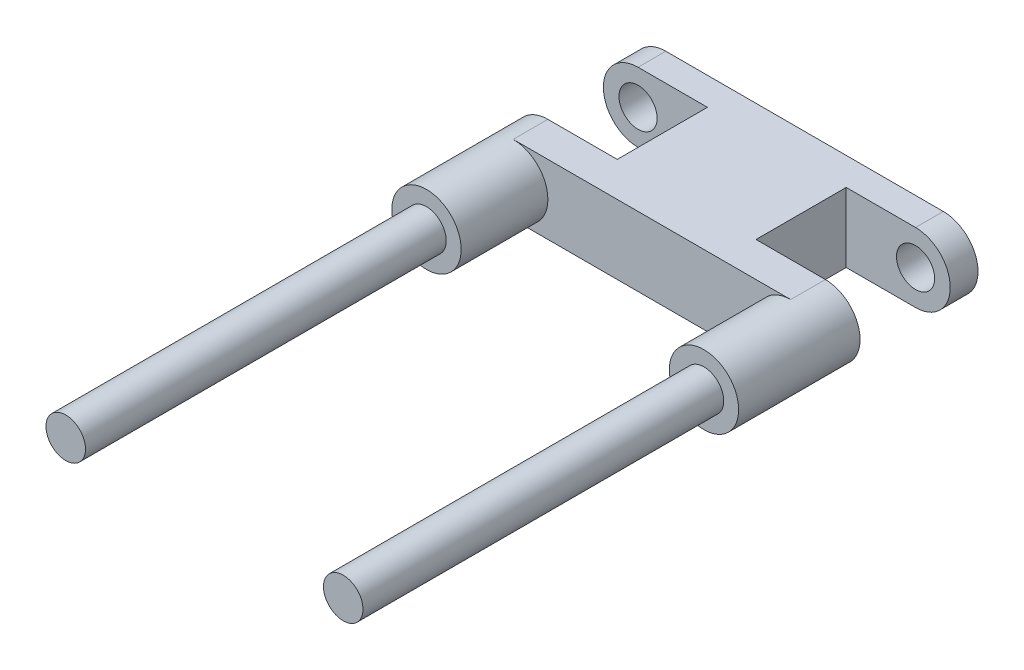
ISO-10303-21;
HEADER;
FILE_DESCRIPTION(('STEP AP214'),'2;1');
FILE_NAME('part.step','',(''),(''),'','','');
FILE_SCHEMA(('AUTOMOTIVE_DESIGN { 1 0 10303 214 1 1 1 1 }'));
ENDSEC;
DATA;
#1=APPLICATION_CONTEXT('core data for automotive mechanical design processes');
#2=APPLICATION_PROTOCOL_DEFINITION('international standard','automotive_design',2000,#1);
#3=PRODUCT_CONTEXT('',#1,'mechanical');
#4=PRODUCT('Part','Part','',(#3));
#5=PRODUCT_RELATED_PRODUCT_CATEGORY('part','',(#4));
#6=PRODUCT_DEFINITION_FORMATION('','',#4);
#7=PRODUCT_DEFINITION_CONTEXT('part definition',#1,'design');
#8=PRODUCT_DEFINITION('design','',#6,#7);
#9=PRODUCT_DEFINITION_SHAPE('','',#8);
#10=(LENGTH_UNIT() NAMED_UNIT(*) SI_UNIT(.MILLI.,.METRE.));
#11=(NAMED_UNIT(*) PLANE_ANGLE_UNIT() SI_UNIT($,.RADIAN.));
#12=(NAMED_UNIT(*) SI_UNIT($,.STERADIAN.) SOLID_ANGLE_UNIT());
#13=UNCERTAINTY_MEASURE_WITH_UNIT(LENGTH_MEASURE(1.E-05),#10,'distance_accuracy_value','');
#14=(GEOMETRIC_REPRESENTATION_CONTEXT(3) GLOBAL_UNCERTAINTY_ASSIGNED_CONTEXT((#13)) GLOBAL_UNIT_ASSIGNED_CONTEXT((#10,
#11,#12)) REPRESENTATION_CONTEXT('',''));
#15=CARTESIAN_POINT('',(0.,0.,0.));
#16=DIRECTION('',(0.,0.,1.));
#17=DIRECTION('',(1.,0.,0.));
#18=AXIS2_PLACEMENT_3D('',#15,#16,#17);
#19=CARTESIAN_POINT('',(-20.,-30.,2.));
#20=DIRECTION('',(0.,0.,-1.));
#21=DIRECTION('',(-1.,0.,0.));
#22=AXIS2_PLACEMENT_3D('',#19,#20,#21);
#23=CYLINDRICAL_SURFACE('',#22,5.);
#24=CARTESIAN_POINT('',(-20.,-30.,0.));
#25=DIRECTION('',(0.,0.,1.));
#26=DIRECTION('',(1.,0.,0.));
#27=AXIS2_PLACEMENT_3D('',#24,#25,#26);
#28=CIRCLE('',#27,5.);
#29=CARTESIAN_POINT('',(-20.,-25.,0.));
#30=VERTEX_POINT('',#29);
#31=CARTESIAN_POINT('',(-20.,-35.,0.));
#32=VERTEX_POINT('',#31);
#33=EDGE_CURVE('E233',#30,#32,#28,.T.);
#34=ORIENTED_EDGE('',*,*,#33,.T.);
#35=DIRECTION('',(0.,0.,-1.));
#36=VECTOR('',#35,1.);
#37=CARTESIAN_POINT('',(-20.,-35.,2.));
#38=LINE('',#37,#36);
#39=CARTESIAN_POINT('',(-20.,-35.,4.));
#40=VERTEX_POINT('',#39);
#41=EDGE_CURVE('E245',#40,#32,#38,.T.);
#42=ORIENTED_EDGE('',*,*,#41,.F.);
#43=CARTESIAN_POINT('',(-20.,-30.,4.));
#44=DIRECTION('',(0.,0.,1.));
#45=DIRECTION('',(1.,0.,0.));
#46=AXIS2_PLACEMENT_3D('',#43,#44,#45);
#47=CIRCLE('',#46,5.);
#48=CARTESIAN_POINT('',(-20.,-25.,4.));
#49=VERTEX_POINT('',#48);
#50=EDGE_CURVE('E171',#49,#40,#47,.T.);
#51=ORIENTED_EDGE('',*,*,#50,.F.);
#52=DIRECTION('',(0.,0.,-1.));
#53=VECTOR('',#52,1.);
#54=CARTESIAN_POINT('',(-20.,-25.,2.));
#55=LINE('',#54,#53);
#56=EDGE_CURVE('E138',#49,#30,#55,.T.);
#57=ORIENTED_EDGE('',*,*,#56,.T.);
#58=EDGE_LOOP('',(#34,#42,#51,#57));
#59=FACE_BOUND('',#58,.T.);
#60=ADVANCED_FACE('F35',(#59),#23,.T.);
#61=CARTESIAN_POINT('',(0.,-35.,2.));
#62=DIRECTION('',(0.,1.,0.));
#63=DIRECTION('',(-1.,0.,0.));
#64=AXIS2_PLACEMENT_3D('',#61,#62,#63);
#65=PLANE('',#64);
#66=DIRECTION('',(0.,0.,-1.));
#67=VECTOR('',#66,1.);
#68=CARTESIAN_POINT('',(20.,-35.,2.));
#69=LINE('',#68,#67);
#70=CARTESIAN_POINT('',(20.,-35.,4.));
#71=VERTEX_POINT('',#70);
#72=CARTESIAN_POINT('',(20.,-35.,0.));
#73=VERTEX_POINT('',#72);
#74=EDGE_CURVE('E137',#71,#73,#69,.T.);
#75=ORIENTED_EDGE('',*,*,#74,.F.);
#76=DIRECTION('',(1.,0.,0.));
#77=VECTOR('',#76,1.);
#78=CARTESIAN_POINT('',(10.,-35.,4.));
#79=LINE('',#78,#77);
#80=CARTESIAN_POINT('',(10.,-35.,4.));
#81=VERTEX_POINT('',#80);
#82=EDGE_CURVE('E151',#81,#71,#79,.T.);
#83=ORIENTED_EDGE('',*,*,#82,.F.);
#84=DIRECTION('',(0.,0.,-1.));
#85=VECTOR('',#84,1.);
#86=CARTESIAN_POINT('',(10.,-35.,17.));
#87=LINE('',#86,#85);
#88=CARTESIAN_POINT('',(10.,-35.,17.));
#89=VERTEX_POINT('',#88);
#90=EDGE_CURVE('E52',#89,#81,#87,.T.);
#91=ORIENTED_EDGE('',*,*,#90,.F.);
#92=DIRECTION('',(1.,0.,0.));
#93=VECTOR('',#92,1.);
#94=CARTESIAN_POINT('',(0.,-35.,17.));
#95=LINE('',#94,#93);
#96=CARTESIAN_POINT('',(20.,-35.,17.));
#97=VERTEX_POINT('',#96);
#98=EDGE_CURVE('E203',#89,#97,#95,.T.);
#99=ORIENTED_EDGE('',*,*,#98,.T.);
#100=DIRECTION('',(0.,0.,-1.));
#101=VECTOR('',#100,1.);
#102=CARTESIAN_POINT('',(20.,-35.,22.));
#103=LINE('',#102,#101);
#104=CARTESIAN_POINT('',(20.,-35.,22.));
#105=VERTEX_POINT('',#104);
#106=EDGE_CURVE('E210',#105,#97,#103,.T.);
#107=ORIENTED_EDGE('',*,*,#106,.F.);
#108=DIRECTION('',(1.,0.,0.));
#109=VECTOR('',#108,1.);
#110=CARTESIAN_POINT('',(0.,-35.,22.));
#111=LINE('',#110,#109);
#112=CARTESIAN_POINT('',(-20.,-35.,22.));
#113=VERTEX_POINT('',#112);
#114=EDGE_CURVE('E195',#113,#105,#111,.T.);
#115=ORIENTED_EDGE('',*,*,#114,.F.);
#116=DIRECTION('',(0.,0.,-1.));
#117=VECTOR('',#116,1.);
#118=CARTESIAN_POINT('',(-20.,-35.,22.));
#119=LINE('',#118,#117);
#120=CARTESIAN_POINT('',(-20.,-35.,17.));
#121=VERTEX_POINT('',#120);
#122=EDGE_CURVE('E213',#113,#121,#119,.T.);
#123=ORIENTED_EDGE('',*,*,#122,.T.);
#124=CARTESIAN_POINT('',(-10.,-35.,17.));
#125=VERTEX_POINT('',#124);
#126=EDGE_CURVE('E204',#121,#125,#95,.T.);
#127=ORIENTED_EDGE('',*,*,#126,.T.);
#128=DIRECTION('',(0.,0.,-1.));
#129=VECTOR('',#128,1.);
#130=CARTESIAN_POINT('',(-10.,-35.,17.));
#131=LINE('',#130,#129);
#132=CARTESIAN_POINT('',(-10.,-35.,4.));
#133=VERTEX_POINT('',#132);
#134=EDGE_CURVE('E225',#125,#133,#131,.T.);
#135=ORIENTED_EDGE('',*,*,#134,.T.);
#136=DIRECTION('',(1.,0.,0.));
#137=VECTOR('',#136,1.);
#138=CARTESIAN_POINT('',(-20.,-35.,4.));
#139=LINE('',#138,#137);
#140=EDGE_CURVE('E162',#40,#133,#139,.T.);
#141=ORIENTED_EDGE('',*,*,#140,.F.);
#142=ORIENTED_EDGE('',*,*,#41,.T.);
#143=DIRECTION('',(1.,0.,0.));
#144=VECTOR('',#143,1.);
#145=CARTESIAN_POINT('',(0.,-35.,0.));
#146=LINE('',#145,#144);
#147=EDGE_CURVE('E236',#32,#73,#146,.T.);
#148=ORIENTED_EDGE('',*,*,#147,.T.);
#149=EDGE_LOOP('',(#75,#83,#91,#99,#107,#115,#123,#127,#135,#141,#142,#148));
#150=FACE_BOUND('',#149,.T.);
#151=ADVANCED_FACE('F261',(#150),#65,.F.);
#152=CARTESIAN_POINT('',(20.,-30.,2.));
#153=DIRECTION('',(0.,0.,-1.));
#154=DIRECTION('',(-1.,0.,0.));
#155=AXIS2_PLACEMENT_3D('',#152,#153,#154);
#156=CYLINDRICAL_SURFACE('',#155,5.);
#157=CARTESIAN_POINT('',(20.,-30.,0.));
#158=DIRECTION('',(0.,0.,1.));
#159=DIRECTION('',(1.,0.,0.));
#160=AXIS2_PLACEMENT_3D('',#157,#158,#159);
#161=CIRCLE('',#160,5.);
#162=CARTESIAN_POINT('',(20.,-25.,0.));
#163=VERTEX_POINT('',#162);
#164=EDGE_CURVE('E133',#73,#163,#161,.T.);
#165=ORIENTED_EDGE('',*,*,#164,.T.);
#166=DIRECTION('',(0.,0.,-1.));
#167=VECTOR('',#166,1.);
#168=CARTESIAN_POINT('',(20.,-25.,2.));
#169=LINE('',#168,#167);
#170=CARTESIAN_POINT('',(20.,-25.,4.));
#171=VERTEX_POINT('',#170);
#172=EDGE_CURVE('E126',#171,#163,#169,.T.);
#173=ORIENTED_EDGE('',*,*,#172,.F.);
#174=CARTESIAN_POINT('',(20.,-30.,4.));
#175=DIRECTION('',(0.,0.,1.));
#176=DIRECTION('',(1.,0.,0.));
#177=AXIS2_PLACEMENT_3D('',#174,#175,#176);
#178=CIRCLE('',#177,5.);
#179=EDGE_CURVE('E131',#71,#171,#178,.T.);
#180=ORIENTED_EDGE('',*,*,#179,.F.);
#181=ORIENTED_EDGE('',*,*,#74,.T.);
#182=EDGE_LOOP('',(#165,#173,#180,#181));
#183=FACE_BOUND('',#182,.T.);
#184=ADVANCED_FACE('F128',(#183),#156,.T.);
#185=CARTESIAN_POINT('',(0.,-25.,2.));
#186=DIRECTION('',(0.,1.,0.));
#187=DIRECTION('',(-1.,0.,0.));
#188=AXIS2_PLACEMENT_3D('',#185,#186,#187);
#189=PLANE('',#188);
#190=DIRECTION('',(-1.,0.,0.));
#191=VECTOR('',#190,1.);
#192=CARTESIAN_POINT('',(20.,-25.,4.));
#193=LINE('',#192,#191);
#194=CARTESIAN_POINT('',(10.,-25.,4.));
#195=VERTEX_POINT('',#194);
#196=EDGE_CURVE('E141',#171,#195,#193,.T.);
#197=ORIENTED_EDGE('',*,*,#196,.F.);
#198=ORIENTED_EDGE('',*,*,#172,.T.);
#199=DIRECTION('',(1.,0.,0.));
#200=VECTOR('',#199,1.);
#201=CARTESIAN_POINT('',(0.,-25.,0.));
#202=LINE('',#201,#200);
#203=EDGE_CURVE('E239',#30,#163,#202,.T.);
#204=ORIENTED_EDGE('',*,*,#203,.F.);
#205=ORIENTED_EDGE('',*,*,#56,.F.);
#206=DIRECTION('',(-1.,0.,0.));
#207=VECTOR('',#206,1.);
#208=CARTESIAN_POINT('',(-10.,-25.,4.));
#209=LINE('',#208,#207);
#210=CARTESIAN_POINT('',(-10.,-25.,4.));
#211=VERTEX_POINT('',#210);
#212=EDGE_CURVE('E168',#211,#49,#209,.T.);
#213=ORIENTED_EDGE('',*,*,#212,.F.);
#214=DIRECTION('',(0.,0.,-1.));
#215=VECTOR('',#214,1.);
#216=CARTESIAN_POINT('',(-10.,-25.,17.));
#217=LINE('',#216,#215);
#218=CARTESIAN_POINT('',(-10.,-25.,17.));
#219=VERTEX_POINT('',#218);
#220=EDGE_CURVE('E228',#219,#211,#217,.T.);
#221=ORIENTED_EDGE('',*,*,#220,.F.);
#222=DIRECTION('',(-1.,0.,0.));
#223=VECTOR('',#222,1.);
#224=CARTESIAN_POINT('',(0.,-25.,17.));
#225=LINE('',#224,#223);
#226=CARTESIAN_POINT('',(-20.,-25.,17.));
#227=VERTEX_POINT('',#226);
#228=EDGE_CURVE('E191',#219,#227,#225,.T.);
#229=ORIENTED_EDGE('',*,*,#228,.T.);
#230=DIRECTION('',(0.,0.,-1.));
#231=VECTOR('',#230,1.);
#232=CARTESIAN_POINT('',(-20.,-25.,22.));
#233=LINE('',#232,#231);
#234=CARTESIAN_POINT('',(-20.,-25.,22.));
#235=VERTEX_POINT('',#234);
#236=EDGE_CURVE('E216',#235,#227,#233,.T.);
#237=ORIENTED_EDGE('',*,*,#236,.F.);
#238=DIRECTION('',(-1.,0.,0.));
#239=VECTOR('',#238,1.);
#240=CARTESIAN_POINT('',(0.,-25.,22.));
#241=LINE('',#240,#239);
#242=CARTESIAN_POINT('',(20.,-25.,22.));
#243=VERTEX_POINT('',#242);
#244=EDGE_CURVE('E192',#243,#235,#241,.T.);
#245=ORIENTED_EDGE('',*,*,#244,.F.);
#246=DIRECTION('',(0.,0.,-1.));
#247=VECTOR('',#246,1.);
#248=CARTESIAN_POINT('',(20.,-25.,22.));
#249=LINE('',#248,#247);
#250=CARTESIAN_POINT('',(20.,-25.,17.));
#251=VERTEX_POINT('',#250);
#252=EDGE_CURVE('E198',#243,#251,#249,.T.);
#253=ORIENTED_EDGE('',*,*,#252,.T.);
#254=CARTESIAN_POINT('',(10.,-25.,17.));
#255=VERTEX_POINT('',#254);
#256=EDGE_CURVE('E199',#251,#255,#225,.T.);
#257=ORIENTED_EDGE('',*,*,#256,.T.);
#258=DIRECTION('',(0.,0.,-1.));
#259=VECTOR('',#258,1.);
#260=CARTESIAN_POINT('',(10.,-25.,17.));
#261=LINE('',#260,#259);
#262=EDGE_CURVE('E144',#255,#195,#261,.T.);
#263=ORIENTED_EDGE('',*,*,#262,.T.);
#264=EDGE_LOOP('',(#197,#198,#204,#205,#213,#221,#229,#237,#245,#253,#257,#263));
#265=FACE_BOUND('',#264,.T.);
#266=ADVANCED_FACE('F142',(#265),#189,.T.);
#267=CARTESIAN_POINT('',(-20.,-30.,2.));
#268=DIRECTION('',(0.,0.,-1.));
#269=DIRECTION('',(-1.,0.,0.));
#270=AXIS2_PLACEMENT_3D('',#267,#268,#269);
#271=CYLINDRICAL_SURFACE('',#270,2.75);
#272=CARTESIAN_POINT('',(-20.,-30.,0.));
#273=DIRECTION('',(0.,0.,1.));
#274=DIRECTION('',(1.,0.,0.));
#275=AXIS2_PLACEMENT_3D('',#272,#273,#274);
#276=CIRCLE('',#275,2.75);
#277=CARTESIAN_POINT('',(-17.25,-30.,0.));
#278=VERTEX_POINT('',#277);
#279=EDGE_CURVE('E230',#278,#278,#276,.T.);
#280=ORIENTED_EDGE('',*,*,#279,.F.);
#281=EDGE_LOOP('',(#280));
#282=FACE_BOUND('',#281,.T.);
#283=CARTESIAN_POINT('',(-20.,-30.,4.));
#284=DIRECTION('',(0.,0.,1.));
#285=DIRECTION('',(1.,0.,0.));
#286=AXIS2_PLACEMENT_3D('',#283,#284,#285);
#287=CIRCLE('',#286,2.75);
#288=CARTESIAN_POINT('',(-17.25,-30.,4.));
#289=VERTEX_POINT('',#288);
#290=EDGE_CURVE('E159',#289,#289,#287,.T.);
#291=ORIENTED_EDGE('',*,*,#290,.T.);
#292=EDGE_LOOP('',(#291));
#293=FACE_BOUND('',#292,.T.);
#294=ADVANCED_FACE('F37',(#282,#293),#271,.F.);
#295=CARTESIAN_POINT('',(20.,-30.,2.));
#296=DIRECTION('',(0.,0.,-1.));
#297=DIRECTION('',(-1.,0.,0.));
#298=AXIS2_PLACEMENT_3D('',#295,#296,#297);
#299=CYLINDRICAL_SURFACE('',#298,2.75);
#300=CARTESIAN_POINT('',(20.,-30.,0.));
#301=DIRECTION('',(0.,0.,1.));
#302=DIRECTION('',(1.,0.,0.));
#303=AXIS2_PLACEMENT_3D('',#300,#301,#302);
#304=CIRCLE('',#303,2.75);
#305=CARTESIAN_POINT('',(22.75,-30.,0.));
#306=VERTEX_POINT('',#305);
#307=EDGE_CURVE('E241',#306,#306,#304,.T.);
#308=ORIENTED_EDGE('',*,*,#307,.F.);
#309=EDGE_LOOP('',(#308));
#310=FACE_BOUND('',#309,.T.);
#311=CARTESIAN_POINT('',(20.,-30.,4.));
#312=DIRECTION('',(0.,0.,1.));
#313=DIRECTION('',(1.,0.,0.));
#314=AXIS2_PLACEMENT_3D('',#311,#312,#313);
#315=CIRCLE('',#314,2.75);
#316=CARTESIAN_POINT('',(22.75,-30.,4.));
#317=VERTEX_POINT('',#316);
#318=EDGE_CURVE('E152',#317,#317,#315,.T.);
#319=ORIENTED_EDGE('',*,*,#318,.T.);
#320=EDGE_LOOP('',(#319));
#321=FACE_BOUND('',#320,.T.);
#322=ADVANCED_FACE('F297',(#310,#321),#299,.F.);
#323=CARTESIAN_POINT('',(0.,0.,0.));
#324=DIRECTION('',(0.,0.,1.));
#325=DIRECTION('',(1.,0.,0.));
#326=AXIS2_PLACEMENT_3D('',#323,#324,#325);
#327=PLANE('',#326);
#328=ORIENTED_EDGE('',*,*,#279,.T.);
#329=EDGE_LOOP('',(#328));
#330=FACE_BOUND('',#329,.T.);
#331=ORIENTED_EDGE('',*,*,#33,.F.);
#332=ORIENTED_EDGE('',*,*,#203,.T.);
#333=ORIENTED_EDGE('',*,*,#164,.F.);
#334=ORIENTED_EDGE('',*,*,#147,.F.);
#335=EDGE_LOOP('',(#331,#332,#333,#334));
#336=FACE_BOUND('',#335,.T.);
#337=ORIENTED_EDGE('',*,*,#307,.T.);
#338=EDGE_LOOP('',(#337));
#339=FACE_BOUND('',#338,.T.);
#340=ADVANCED_FACE('F281',(#330,#336,#339),#327,.F.);
#341=CARTESIAN_POINT('',(-10.,0.,17.));
#342=DIRECTION('',(1.,0.,0.));
#343=DIRECTION('',(0.,0.,-1.));
#344=AXIS2_PLACEMENT_3D('',#341,#342,#343);
#345=PLANE('',#344);
#346=ORIENTED_EDGE('',*,*,#220,.T.);
#347=DIRECTION('',(0.,1.,0.));
#348=VECTOR('',#347,1.);
#349=CARTESIAN_POINT('',(-10.,-35.,4.));
#350=LINE('',#349,#348);
#351=EDGE_CURVE('E165',#133,#211,#350,.T.);
#352=ORIENTED_EDGE('',*,*,#351,.F.);
#353=ORIENTED_EDGE('',*,*,#134,.F.);
#354=DIRECTION('',(0.,-1.,0.));
#355=VECTOR('',#354,1.);
#356=CARTESIAN_POINT('',(-10.,0.,17.));
#357=LINE('',#356,#355);
#358=EDGE_CURVE('E219',#219,#125,#357,.T.);
#359=ORIENTED_EDGE('',*,*,#358,.F.);
#360=EDGE_LOOP('',(#346,#352,#353,#359));
#361=FACE_BOUND('',#360,.T.);
#362=ADVANCED_FACE('F273',(#361),#345,.F.);
#363=CARTESIAN_POINT('',(10.,0.,17.));
#364=DIRECTION('',(1.,0.,0.));
#365=DIRECTION('',(0.,0.,-1.));
#366=AXIS2_PLACEMENT_3D('',#363,#364,#365);
#367=PLANE('',#366);
#368=DIRECTION('',(0.,-1.,0.));
#369=VECTOR('',#368,1.);
#370=CARTESIAN_POINT('',(10.,-25.,4.));
#371=LINE('',#370,#369);
#372=EDGE_CURVE('E56',#195,#81,#371,.T.);
#373=ORIENTED_EDGE('',*,*,#372,.F.);
#374=ORIENTED_EDGE('',*,*,#262,.F.);
#375=DIRECTION('',(0.,-1.,0.));
#376=VECTOR('',#375,1.);
#377=CARTESIAN_POINT('',(10.,0.,17.));
#378=LINE('',#377,#376);
#379=EDGE_CURVE('E221',#255,#89,#378,.T.);
#380=ORIENTED_EDGE('',*,*,#379,.T.);
#381=ORIENTED_EDGE('',*,*,#90,.T.);
#382=EDGE_LOOP('',(#373,#374,#380,#381));
#383=FACE_BOUND('',#382,.T.);
#384=ADVANCED_FACE('F270',(#383),#367,.T.);
#385=CARTESIAN_POINT('',(0.,0.,17.));
#386=DIRECTION('',(0.,0.,1.));
#387=DIRECTION('',(1.,0.,0.));
#388=AXIS2_PLACEMENT_3D('',#385,#386,#387);
#389=PLANE('',#388);
#390=ORIENTED_EDGE('',*,*,#228,.F.);
#391=ORIENTED_EDGE('',*,*,#358,.T.);
#392=ORIENTED_EDGE('',*,*,#126,.F.);
#393=CARTESIAN_POINT('',(-20.,-30.,17.));
#394=DIRECTION('',(0.,0.,1.));
#395=DIRECTION('',(1.,0.,0.));
#396=AXIS2_PLACEMENT_3D('',#393,#394,#395);
#397=CIRCLE('',#396,5.);
#398=EDGE_CURVE('E201',#227,#121,#397,.T.);
#399=ORIENTED_EDGE('',*,*,#398,.F.);
#400=EDGE_LOOP('',(#390,#391,#392,#399));
#401=FACE_BOUND('',#400,.T.);
#402=ADVANCED_FACE('F272',(#401),#389,.F.);
#403=CARTESIAN_POINT('',(-20.,-30.,22.));
#404=DIRECTION('',(0.,0.,-1.));
#405=DIRECTION('',(-1.,0.,0.));
#406=AXIS2_PLACEMENT_3D('',#403,#404,#405);
#407=CYLINDRICAL_SURFACE('',#406,5.);
#408=ORIENTED_EDGE('',*,*,#398,.T.);
#409=ORIENTED_EDGE('',*,*,#122,.F.);
#410=CARTESIAN_POINT('',(-20.,-30.,22.));
#411=DIRECTION('',(0.,0.,1.));
#412=DIRECTION('',(1.,0.,0.));
#413=AXIS2_PLACEMENT_3D('',#410,#411,#412);
#414=CIRCLE('',#413,5.);
#415=EDGE_CURVE('E39',#235,#113,#414,.F.);
#416=ORIENTED_EDGE('',*,*,#415,.F.);
#417=ORIENTED_EDGE('',*,*,#236,.T.);
#418=EDGE_LOOP('',(#408,#409,#416,#417));
#419=FACE_BOUND('',#418,.T.);
#420=CARTESIAN_POINT('',(-20.,-30.,34.5));
#421=DIRECTION('',(0.,0.,-1.));
#422=DIRECTION('',(-1.,0.,0.));
#423=AXIS2_PLACEMENT_3D('',#420,#421,#422);
#424=CIRCLE('',#423,5.);
#425=CARTESIAN_POINT('',(-25.,-30.,34.5));
#426=VERTEX_POINT('',#425);
#427=EDGE_CURVE('E182',#426,#426,#424,.T.);
#428=ORIENTED_EDGE('',*,*,#427,.T.);
#429=EDGE_LOOP('',(#428));
#430=FACE_BOUND('',#429,.T.);
#431=ADVANCED_FACE('F257',(#419,#430),#407,.T.);
#432=CARTESIAN_POINT('',(20.,-30.,22.));
#433=DIRECTION('',(0.,0.,-1.));
#434=DIRECTION('',(-1.,0.,0.));
#435=AXIS2_PLACEMENT_3D('',#432,#433,#434);
#436=CYLINDRICAL_SURFACE('',#435,5.);
#437=CARTESIAN_POINT('',(20.,-30.,17.));
#438=DIRECTION('',(0.,0.,1.));
#439=DIRECTION('',(1.,0.,0.));
#440=AXIS2_PLACEMENT_3D('',#437,#438,#439);
#441=CIRCLE('',#440,5.);
#442=EDGE_CURVE('E196',#97,#251,#441,.T.);
#443=ORIENTED_EDGE('',*,*,#442,.T.);
#444=ORIENTED_EDGE('',*,*,#252,.F.);
#445=CARTESIAN_POINT('',(20.,-30.,22.));
#446=DIRECTION('',(0.,0.,1.));
#447=DIRECTION('',(1.,0.,0.));
#448=AXIS2_PLACEMENT_3D('',#445,#446,#447);
#449=CIRCLE('',#448,5.);
#450=EDGE_CURVE('E185',#243,#105,#449,.T.);
#451=ORIENTED_EDGE('',*,*,#450,.T.);
#452=ORIENTED_EDGE('',*,*,#106,.T.);
#453=EDGE_LOOP('',(#443,#444,#451,#452));
#454=FACE_BOUND('',#453,.T.);
#455=CARTESIAN_POINT('',(20.,-30.,34.5));
#456=DIRECTION('',(0.,0.,-1.));
#457=DIRECTION('',(-1.,0.,0.));
#458=AXIS2_PLACEMENT_3D('',#455,#456,#457);
#459=CIRCLE('',#458,5.);
#460=CARTESIAN_POINT('',(15.,-30.,34.5));
#461=VERTEX_POINT('',#460);
#462=EDGE_CURVE('E188',#461,#461,#459,.T.);
#463=ORIENTED_EDGE('',*,*,#462,.T.);
#464=EDGE_LOOP('',(#463));
#465=FACE_BOUND('',#464,.T.);
#466=ADVANCED_FACE('F265',(#454,#465),#436,.T.);
#467=CARTESIAN_POINT('',(0.,0.,22.));
#468=DIRECTION('',(0.,0.,1.));
#469=DIRECTION('',(1.,0.,0.));
#470=AXIS2_PLACEMENT_3D('',#467,#468,#469);
#471=PLANE('',#470);
#472=ORIENTED_EDGE('',*,*,#244,.T.);
#473=ORIENTED_EDGE('',*,*,#415,.T.);
#474=ORIENTED_EDGE('',*,*,#114,.T.);
#475=ORIENTED_EDGE('',*,*,#450,.F.);
#476=EDGE_LOOP('',(#472,#473,#474,#475));
#477=FACE_BOUND('',#476,.T.);
#478=ADVANCED_FACE('F251',(#477),#471,.T.);
#479=ORIENTED_EDGE('',*,*,#379,.F.);
#480=ORIENTED_EDGE('',*,*,#256,.F.);
#481=ORIENTED_EDGE('',*,*,#442,.F.);
#482=ORIENTED_EDGE('',*,*,#98,.F.);
#483=EDGE_LOOP('',(#479,#480,#481,#482));
#484=FACE_BOUND('',#483,.T.);
#485=ADVANCED_FACE('F269',(#484),#389,.F.);
#486=CARTESIAN_POINT('',(0.,0.,34.5));
#487=DIRECTION('',(0.,0.,-1.));
#488=DIRECTION('',(-1.,0.,0.));
#489=AXIS2_PLACEMENT_3D('',#486,#487,#488);
#490=PLANE('',#489);
#491=CARTESIAN_POINT('',(20.0000000000002,-29.9999999999993,34.5));
#492=DIRECTION('',(0.,0.,1.));
#493=DIRECTION('',(1.,0.,0.));
#494=AXIS2_PLACEMENT_3D('',#491,#492,#493);
#495=CIRCLE('',#494,2.84999999999966);
#496=CARTESIAN_POINT('',(22.8499999999998,-29.9999999999993,34.5));
#497=VERTEX_POINT('',#496);
#498=EDGE_CURVE('E44',#497,#497,#495,.T.);
#499=ORIENTED_EDGE('',*,*,#498,.F.);
#500=EDGE_LOOP('',(#499));
#501=FACE_BOUND('',#500,.T.);
#502=ORIENTED_EDGE('',*,*,#462,.F.);
#503=EDGE_LOOP('',(#502));
#504=FACE_BOUND('',#503,.T.);
#505=ADVANCED_FACE('F339',(#501,#504),#490,.F.);
#506=CARTESIAN_POINT('',(0.,0.,34.5));
#507=DIRECTION('',(0.,0.,-1.));
#508=DIRECTION('',(-1.,0.,0.));
#509=AXIS2_PLACEMENT_3D('',#506,#507,#508);
#510=PLANE('',#509);
#511=CARTESIAN_POINT('',(-19.9999999999998,-29.9999999999993,34.5));
#512=DIRECTION('',(0.,0.,1.));
#513=DIRECTION('',(1.,0.,0.));
#514=AXIS2_PLACEMENT_3D('',#511,#512,#513);
#515=CIRCLE('',#514,2.84999999999966);
#516=CARTESIAN_POINT('',(-17.1500000000002,-29.9999999999993,34.5));
#517=VERTEX_POINT('',#516);
#518=EDGE_CURVE('E11',#517,#517,#515,.T.);
#519=ORIENTED_EDGE('',*,*,#518,.F.);
#520=EDGE_LOOP('',(#519));
#521=FACE_BOUND('',#520,.T.);
#522=ORIENTED_EDGE('',*,*,#427,.F.);
#523=EDGE_LOOP('',(#522));
#524=FACE_BOUND('',#523,.T.);
#525=ADVANCED_FACE('F332',(#521,#524),#510,.F.);
#526=CARTESIAN_POINT('',(20.0000000000002,-29.9999999999993,94.5610173055257));
#527=DIRECTION('',(0.,0.,-1.));
#528=DIRECTION('',(-1.,0.,0.));
#529=AXIS2_PLACEMENT_3D('',#526,#527,#528);
#530=CYLINDRICAL_SURFACE('',#529,2.84999999999966);
#531=ORIENTED_EDGE('',*,*,#498,.T.);
#532=EDGE_LOOP('',(#531));
#533=FACE_BOUND('',#532,.T.);
#534=CARTESIAN_POINT('',(20.0000000000002,-29.9999999999993,86.5));
#535=DIRECTION('',(0.,0.,1.));
#536=DIRECTION('',(1.,0.,0.));
#537=AXIS2_PLACEMENT_3D('',#534,#535,#536);
#538=CIRCLE('',#537,2.84999999999966);
#539=CARTESIAN_POINT('',(22.8499999999998,-29.9999999999993,86.5));
#540=VERTEX_POINT('',#539);
#541=EDGE_CURVE('E177',#540,#540,#538,.T.);
#542=ORIENTED_EDGE('',*,*,#541,.F.);
#543=EDGE_LOOP('',(#542));
#544=FACE_BOUND('',#543,.T.);
#545=ADVANCED_FACE('F329',(#533,#544),#530,.T.);
#546=CARTESIAN_POINT('',(0.,0.,86.5));
#547=DIRECTION('',(0.,0.,1.));
#548=DIRECTION('',(1.,0.,0.));
#549=AXIS2_PLACEMENT_3D('',#546,#547,#548);
#550=PLANE('',#549);
#551=ORIENTED_EDGE('',*,*,#541,.T.);
#552=EDGE_LOOP('',(#551));
#553=FACE_BOUND('',#552,.T.);
#554=ADVANCED_FACE('F324',(#553),#550,.T.);
#555=CARTESIAN_POINT('',(-19.9999999999998,-29.9999999999993,94.5610173055257));
#556=DIRECTION('',(0.,0.,-1.));
#557=DIRECTION('',(-1.,0.,0.));
#558=AXIS2_PLACEMENT_3D('',#555,#556,#557);
#559=CYLINDRICAL_SURFACE('',#558,2.84999999999966);
#560=ORIENTED_EDGE('',*,*,#518,.T.);
#561=EDGE_LOOP('',(#560));
#562=FACE_BOUND('',#561,.T.);
#563=CARTESIAN_POINT('',(-19.9999999999998,-29.9999999999993,86.5));
#564=DIRECTION('',(0.,0.,1.));
#565=DIRECTION('',(1.,0.,0.));
#566=AXIS2_PLACEMENT_3D('',#563,#564,#565);
#567=CIRCLE('',#566,2.84999999999966);
#568=CARTESIAN_POINT('',(-17.1500000000002,-29.9999999999993,86.5));
#569=VERTEX_POINT('',#568);
#570=EDGE_CURVE('E173',#569,#569,#567,.T.);
#571=ORIENTED_EDGE('',*,*,#570,.F.);
#572=EDGE_LOOP('',(#571));
#573=FACE_BOUND('',#572,.T.);
#574=ADVANCED_FACE('F321',(#562,#573),#559,.T.);
#575=CARTESIAN_POINT('',(0.,0.,86.5));
#576=DIRECTION('',(0.,0.,1.));
#577=DIRECTION('',(1.,0.,0.));
#578=AXIS2_PLACEMENT_3D('',#575,#576,#577);
#579=PLANE('',#578);
#580=ORIENTED_EDGE('',*,*,#570,.T.);
#581=EDGE_LOOP('',(#580));
#582=FACE_BOUND('',#581,.T.);
#583=ADVANCED_FACE('F317',(#582),#579,.T.);
#584=CARTESIAN_POINT('',(-20.,-30.,4.));
#585=DIRECTION('',(0.,0.,1.));
#586=DIRECTION('',(1.,0.,0.));
#587=AXIS2_PLACEMENT_3D('',#584,#585,#586);
#588=PLANE('',#587);
#589=ORIENTED_EDGE('',*,*,#140,.T.);
#590=ORIENTED_EDGE('',*,*,#351,.T.);
#591=ORIENTED_EDGE('',*,*,#212,.T.);
#592=ORIENTED_EDGE('',*,*,#50,.T.);
#593=EDGE_LOOP('',(#589,#590,#591,#592));
#594=FACE_BOUND('',#593,.T.);
#595=ORIENTED_EDGE('',*,*,#290,.F.);
#596=EDGE_LOOP('',(#595));
#597=FACE_BOUND('',#596,.T.);
#598=ADVANCED_FACE('F312',(#594,#597),#588,.T.);
#599=CARTESIAN_POINT('',(20.,-30.,4.));
#600=DIRECTION('',(0.,0.,1.));
#601=DIRECTION('',(1.,0.,0.));
#602=AXIS2_PLACEMENT_3D('',#599,#600,#601);
#603=PLANE('',#602);
#604=ORIENTED_EDGE('',*,*,#179,.T.);
#605=ORIENTED_EDGE('',*,*,#196,.T.);
#606=ORIENTED_EDGE('',*,*,#372,.T.);
#607=ORIENTED_EDGE('',*,*,#82,.T.);
#608=EDGE_LOOP('',(#604,#605,#606,#607));
#609=FACE_BOUND('',#608,.T.);
#610=ORIENTED_EDGE('',*,*,#318,.F.);
#611=EDGE_LOOP('',(#610));
#612=FACE_BOUND('',#611,.T.);
#613=ADVANCED_FACE('F148',(#609,#612),#603,.T.);
#614=CLOSED_SHELL('',(#60,#151,#184,#266,#294,#322,#340,#362,#384,#402,#431,#466,#478,#485,#505,
#525,#545,#554,#574,#583,#598,#613));
#615=MANIFOLD_SOLID_BREP('B2',#614);
#616=ADVANCED_BREP_SHAPE_REPRESENTATION('',(#18,#615),#14);
#617=SHAPE_DEFINITION_REPRESENTATION(#9,#616);
ENDSEC;
END-ISO-10303-21;
